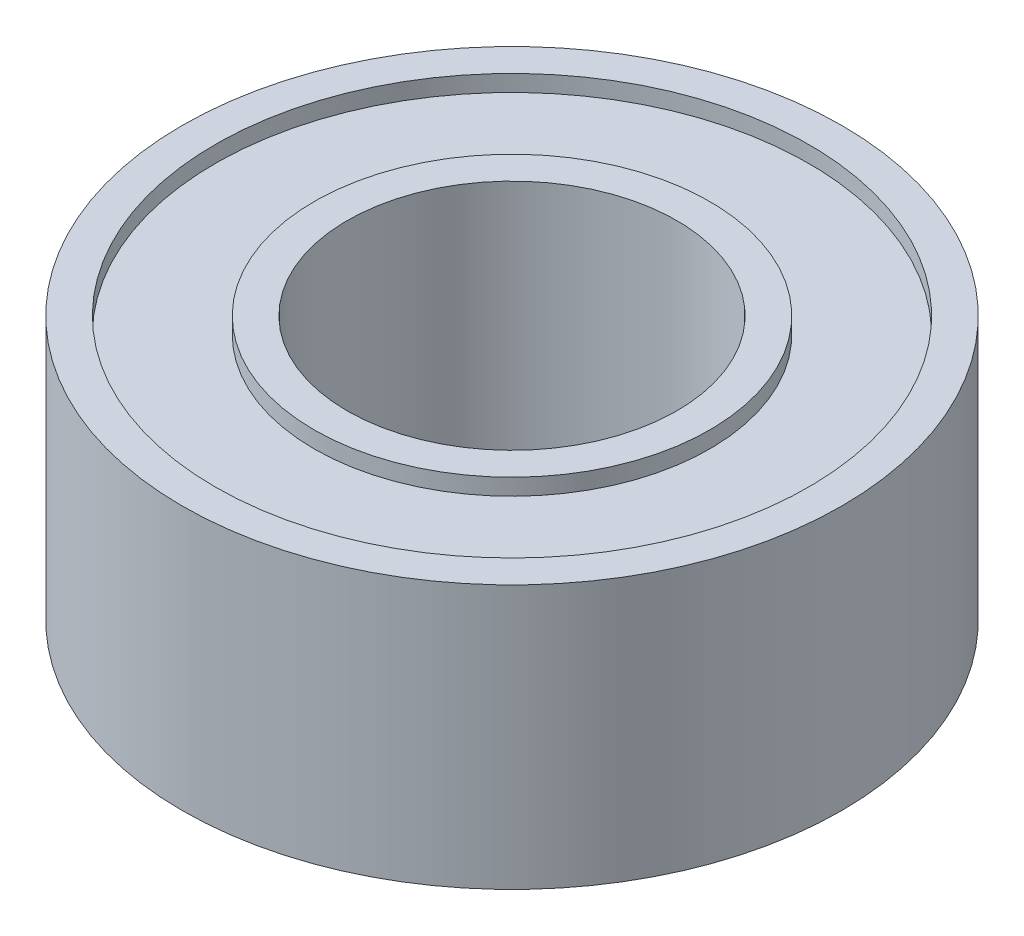
ISO-10303-21;
HEADER;
FILE_DESCRIPTION(('STEP AP214'),'2;1');
FILE_NAME('part.step','',(''),(''),'','','');
FILE_SCHEMA(('AUTOMOTIVE_DESIGN { 1 0 10303 214 1 1 1 1 }'));
ENDSEC;
DATA;
#1=APPLICATION_CONTEXT('core data for automotive mechanical design processes');
#2=APPLICATION_PROTOCOL_DEFINITION('international standard','automotive_design',2000,#1);
#3=PRODUCT_CONTEXT('',#1,'mechanical');
#4=PRODUCT('Part','Part','',(#3));
#5=PRODUCT_RELATED_PRODUCT_CATEGORY('part','',(#4));
#6=PRODUCT_DEFINITION_FORMATION('','',#4);
#7=PRODUCT_DEFINITION_CONTEXT('part definition',#1,'design');
#8=PRODUCT_DEFINITION('design','',#6,#7);
#9=PRODUCT_DEFINITION_SHAPE('','',#8);
#10=(LENGTH_UNIT() NAMED_UNIT(*) SI_UNIT(.MILLI.,.METRE.));
#11=(NAMED_UNIT(*) PLANE_ANGLE_UNIT() SI_UNIT($,.RADIAN.));
#12=(NAMED_UNIT(*) SI_UNIT($,.STERADIAN.) SOLID_ANGLE_UNIT());
#13=UNCERTAINTY_MEASURE_WITH_UNIT(LENGTH_MEASURE(1.E-05),#10,'distance_accuracy_value','');
#14=(GEOMETRIC_REPRESENTATION_CONTEXT(3) GLOBAL_UNCERTAINTY_ASSIGNED_CONTEXT((#13)) GLOBAL_UNIT_ASSIGNED_CONTEXT((#10,
#11,#12)) REPRESENTATION_CONTEXT('',''));
#15=CARTESIAN_POINT('',(0.,0.,0.));
#16=DIRECTION('',(0.,0.,1.));
#17=DIRECTION('',(1.,0.,0.));
#18=AXIS2_PLACEMENT_3D('',#15,#16,#17);
#19=CARTESIAN_POINT('',(0.,2.,0.));
#20=DIRECTION('',(0.,-1.,0.));
#21=DIRECTION('',(0.,0.,-1.));
#22=AXIS2_PLACEMENT_3D('',#19,#20,#21);
#23=CYLINDRICAL_SURFACE('',#22,3.);
#24=CARTESIAN_POINT('',(0.,-2.,0.));
#25=DIRECTION('',(0.,1.,0.));
#26=DIRECTION('',(0.,0.,1.));
#27=AXIS2_PLACEMENT_3D('',#24,#25,#26);
#28=CIRCLE('',#27,3.);
#29=CARTESIAN_POINT('',(0.,-2.,3.));
#30=VERTEX_POINT('',#29);
#31=EDGE_CURVE('E74',#30,#30,#28,.T.);
#32=ORIENTED_EDGE('',*,*,#31,.T.);
#33=EDGE_LOOP('',(#32));
#34=FACE_BOUND('',#33,.T.);
#35=CARTESIAN_POINT('',(0.,-1.75,0.));
#36=DIRECTION('',(0.,1.,0.));
#37=DIRECTION('',(0.,0.,1.));
#38=AXIS2_PLACEMENT_3D('',#35,#36,#37);
#39=CIRCLE('',#38,3.);
#40=CARTESIAN_POINT('',(0.,-1.75,3.));
#41=VERTEX_POINT('',#40);
#42=EDGE_CURVE('E11',#41,#41,#39,.T.);
#43=ORIENTED_EDGE('',*,*,#42,.F.);
#44=EDGE_LOOP('',(#43));
#45=FACE_BOUND('',#44,.T.);
#46=ADVANCED_FACE('F55',(#34,#45),#23,.T.);
#47=CARTESIAN_POINT('',(0.,2.,0.));
#48=DIRECTION('',(0.,-1.,0.));
#49=DIRECTION('',(0.,0.,-1.));
#50=AXIS2_PLACEMENT_3D('',#47,#48,#49);
#51=CYLINDRICAL_SURFACE('',#50,2.5);
#52=CARTESIAN_POINT('',(0.,2.,0.));
#53=DIRECTION('',(0.,1.,0.));
#54=DIRECTION('',(0.,0.,1.));
#55=AXIS2_PLACEMENT_3D('',#52,#53,#54);
#56=CIRCLE('',#55,2.5);
#57=CARTESIAN_POINT('',(0.,2.,2.5));
#58=VERTEX_POINT('',#57);
#59=EDGE_CURVE('E68',#58,#58,#56,.T.);
#60=ORIENTED_EDGE('',*,*,#59,.T.);
#61=EDGE_LOOP('',(#60));
#62=FACE_BOUND('',#61,.T.);
#63=CARTESIAN_POINT('',(0.,-2.,0.));
#64=DIRECTION('',(0.,1.,0.));
#65=DIRECTION('',(0.,0.,1.));
#66=AXIS2_PLACEMENT_3D('',#63,#64,#65);
#67=CIRCLE('',#66,2.5);
#68=CARTESIAN_POINT('',(0.,-2.,2.5));
#69=VERTEX_POINT('',#68);
#70=EDGE_CURVE('E78',#69,#69,#67,.T.);
#71=ORIENTED_EDGE('',*,*,#70,.F.);
#72=EDGE_LOOP('',(#71));
#73=FACE_BOUND('',#72,.T.);
#74=ADVANCED_FACE('F57',(#62,#73),#51,.F.);
#75=CARTESIAN_POINT('',(0.,1.75,0.));
#76=DIRECTION('',(0.,1.,0.));
#77=DIRECTION('',(0.,0.,1.));
#78=AXIS2_PLACEMENT_3D('',#75,#76,#77);
#79=CIRCLE('',#78,3.);
#80=CARTESIAN_POINT('',(0.,1.75,3.));
#81=VERTEX_POINT('',#80);
#82=EDGE_CURVE('E81',#81,#81,#79,.T.);
#83=ORIENTED_EDGE('',*,*,#82,.T.);
#84=EDGE_LOOP('',(#83));
#85=FACE_BOUND('',#84,.T.);
#86=CARTESIAN_POINT('',(0.,2.,0.));
#87=DIRECTION('',(0.,1.,0.));
#88=DIRECTION('',(0.,0.,1.));
#89=AXIS2_PLACEMENT_3D('',#86,#87,#88);
#90=CIRCLE('',#89,3.);
#91=CARTESIAN_POINT('',(0.,2.,3.));
#92=VERTEX_POINT('',#91);
#93=EDGE_CURVE('E63',#92,#92,#90,.T.);
#94=ORIENTED_EDGE('',*,*,#93,.F.);
#95=EDGE_LOOP('',(#94));
#96=FACE_BOUND('',#95,.T.);
#97=ADVANCED_FACE('F101',(#85,#96),#23,.T.);
#98=CARTESIAN_POINT('',(0.,2.,0.));
#99=DIRECTION('',(0.,1.,0.));
#100=DIRECTION('',(0.,0.,1.));
#101=AXIS2_PLACEMENT_3D('',#98,#99,#100);
#102=PLANE('',#101);
#103=ORIENTED_EDGE('',*,*,#59,.F.);
#104=EDGE_LOOP('',(#103));
#105=FACE_BOUND('',#104,.T.);
#106=ORIENTED_EDGE('',*,*,#93,.T.);
#107=EDGE_LOOP('',(#106));
#108=FACE_BOUND('',#107,.T.);
#109=ADVANCED_FACE('F91',(#105,#108),#102,.T.);
#110=CARTESIAN_POINT('',(0.,-2.,0.));
#111=DIRECTION('',(0.,1.,0.));
#112=DIRECTION('',(0.,0.,1.));
#113=AXIS2_PLACEMENT_3D('',#110,#111,#112);
#114=PLANE('',#113);
#115=ORIENTED_EDGE('',*,*,#70,.T.);
#116=EDGE_LOOP('',(#115));
#117=FACE_BOUND('',#116,.T.);
#118=ORIENTED_EDGE('',*,*,#31,.F.);
#119=EDGE_LOOP('',(#118));
#120=FACE_BOUND('',#119,.T.);
#121=ADVANCED_FACE('F88',(#117,#120),#114,.F.);
#122=CARTESIAN_POINT('',(0.,1.75,0.));
#123=DIRECTION('',(0.,1.,0.));
#124=DIRECTION('',(0.,0.,1.));
#125=AXIS2_PLACEMENT_3D('',#122,#123,#124);
#126=PLANE('',#125);
#127=ORIENTED_EDGE('',*,*,#82,.F.);
#128=EDGE_LOOP('',(#127));
#129=FACE_BOUND('',#128,.T.);
#130=CARTESIAN_POINT('',(0.,1.75,0.));
#131=DIRECTION('',(0.,1.,0.));
#132=DIRECTION('',(0.,0.,1.));
#133=AXIS2_PLACEMENT_3D('',#130,#131,#132);
#134=CIRCLE('',#133,4.5);
#135=CARTESIAN_POINT('',(0.,1.75,4.5));
#136=VERTEX_POINT('',#135);
#137=EDGE_CURVE('E121',#136,#136,#134,.F.);
#138=ORIENTED_EDGE('',*,*,#137,.F.);
#139=EDGE_LOOP('',(#138));
#140=FACE_BOUND('',#139,.T.);
#141=ADVANCED_FACE('F90',(#129,#140),#126,.T.);
#142=CARTESIAN_POINT('',(0.,-1.75,0.));
#143=DIRECTION('',(0.,1.,0.));
#144=DIRECTION('',(0.,0.,1.));
#145=AXIS2_PLACEMENT_3D('',#142,#143,#144);
#146=PLANE('',#145);
#147=ORIENTED_EDGE('',*,*,#42,.T.);
#148=EDGE_LOOP('',(#147));
#149=FACE_BOUND('',#148,.T.);
#150=CARTESIAN_POINT('',(0.,-1.75,0.));
#151=DIRECTION('',(0.,1.,0.));
#152=DIRECTION('',(0.,0.,1.));
#153=AXIS2_PLACEMENT_3D('',#150,#151,#152);
#154=CIRCLE('',#153,4.5);
#155=CARTESIAN_POINT('',(0.,-1.75,4.5));
#156=VERTEX_POINT('',#155);
#157=EDGE_CURVE('E117',#156,#156,#154,.T.);
#158=ORIENTED_EDGE('',*,*,#157,.F.);
#159=EDGE_LOOP('',(#158));
#160=FACE_BOUND('',#159,.T.);
#161=ADVANCED_FACE('F98',(#149,#160),#146,.F.);
#162=CARTESIAN_POINT('',(0.,2.,0.));
#163=DIRECTION('',(0.,-1.,0.));
#164=DIRECTION('',(0.,0.,-1.));
#165=AXIS2_PLACEMENT_3D('',#162,#163,#164);
#166=CYLINDRICAL_SURFACE('',#165,4.5);
#167=CARTESIAN_POINT('',(0.,-2.,0.));
#168=DIRECTION('',(0.,1.,0.));
#169=DIRECTION('',(0.,0.,1.));
#170=AXIS2_PLACEMENT_3D('',#167,#168,#169);
#171=CIRCLE('',#170,4.5);
#172=CARTESIAN_POINT('',(0.,-2.,4.5));
#173=VERTEX_POINT('',#172);
#174=EDGE_CURVE('E132',#173,#173,#171,.T.);
#175=ORIENTED_EDGE('',*,*,#174,.F.);
#176=EDGE_LOOP('',(#175));
#177=FACE_BOUND('',#176,.T.);
#178=ORIENTED_EDGE('',*,*,#157,.T.);
#179=EDGE_LOOP('',(#178));
#180=FACE_BOUND('',#179,.T.);
#181=ADVANCED_FACE('F165',(#177,#180),#166,.F.);
#182=ORIENTED_EDGE('',*,*,#137,.T.);
#183=EDGE_LOOP('',(#182));
#184=FACE_BOUND('',#183,.T.);
#185=CARTESIAN_POINT('',(0.,2.,0.));
#186=DIRECTION('',(0.,1.,0.));
#187=DIRECTION('',(0.,0.,1.));
#188=AXIS2_PLACEMENT_3D('',#185,#186,#187);
#189=CIRCLE('',#188,4.5);
#190=CARTESIAN_POINT('',(0.,2.,4.5));
#191=VERTEX_POINT('',#190);
#192=EDGE_CURVE('E131',#191,#191,#189,.T.);
#193=ORIENTED_EDGE('',*,*,#192,.T.);
#194=EDGE_LOOP('',(#193));
#195=FACE_BOUND('',#194,.T.);
#196=ADVANCED_FACE('F143',(#184,#195),#166,.F.);
#197=CARTESIAN_POINT('',(0.,2.,0.));
#198=DIRECTION('',(0.,-1.,0.));
#199=DIRECTION('',(0.,0.,-1.));
#200=AXIS2_PLACEMENT_3D('',#197,#198,#199);
#201=CYLINDRICAL_SURFACE('',#200,5.);
#202=CARTESIAN_POINT('',(0.,2.,0.));
#203=DIRECTION('',(0.,1.,0.));
#204=DIRECTION('',(0.,0.,1.));
#205=AXIS2_PLACEMENT_3D('',#202,#203,#204);
#206=CIRCLE('',#205,5.);
#207=CARTESIAN_POINT('',(0.,2.,5.));
#208=VERTEX_POINT('',#207);
#209=EDGE_CURVE('E126',#208,#208,#206,.T.);
#210=ORIENTED_EDGE('',*,*,#209,.F.);
#211=EDGE_LOOP('',(#210));
#212=FACE_BOUND('',#211,.T.);
#213=CARTESIAN_POINT('',(0.,-2.,0.));
#214=DIRECTION('',(0.,1.,0.));
#215=DIRECTION('',(0.,0.,1.));
#216=AXIS2_PLACEMENT_3D('',#213,#214,#215);
#217=CIRCLE('',#216,5.);
#218=CARTESIAN_POINT('',(0.,-2.,5.));
#219=VERTEX_POINT('',#218);
#220=EDGE_CURVE('E127',#219,#219,#217,.T.);
#221=ORIENTED_EDGE('',*,*,#220,.T.);
#222=EDGE_LOOP('',(#221));
#223=FACE_BOUND('',#222,.T.);
#224=ADVANCED_FACE('F149',(#212,#223),#201,.T.);
#225=CARTESIAN_POINT('',(0.,2.,0.));
#226=DIRECTION('',(0.,1.,0.));
#227=DIRECTION('',(0.,0.,1.));
#228=AXIS2_PLACEMENT_3D('',#225,#226,#227);
#229=PLANE('',#228);
#230=ORIENTED_EDGE('',*,*,#192,.F.);
#231=EDGE_LOOP('',(#230));
#232=FACE_BOUND('',#231,.T.);
#233=ORIENTED_EDGE('',*,*,#209,.T.);
#234=EDGE_LOOP('',(#233));
#235=FACE_BOUND('',#234,.T.);
#236=ADVANCED_FACE('F145',(#232,#235),#229,.T.);
#237=CARTESIAN_POINT('',(0.,-2.,0.));
#238=DIRECTION('',(0.,1.,0.));
#239=DIRECTION('',(0.,0.,1.));
#240=AXIS2_PLACEMENT_3D('',#237,#238,#239);
#241=PLANE('',#240);
#242=ORIENTED_EDGE('',*,*,#174,.T.);
#243=EDGE_LOOP('',(#242));
#244=FACE_BOUND('',#243,.T.);
#245=ORIENTED_EDGE('',*,*,#220,.F.);
#246=EDGE_LOOP('',(#245));
#247=FACE_BOUND('',#246,.T.);
#248=ADVANCED_FACE('F148',(#244,#247),#241,.F.);
#249=CLOSED_SHELL('',(#46,#74,#97,#109,#121,#141,#161,#181,#196,#224,#236,#248));
#250=MANIFOLD_SOLID_BREP('B2',#249);
#251=ADVANCED_BREP_SHAPE_REPRESENTATION('',(#18,#250),#14);
#252=SHAPE_DEFINITION_REPRESENTATION(#9,#251);
ENDSEC;
END-ISO-10303-21;
